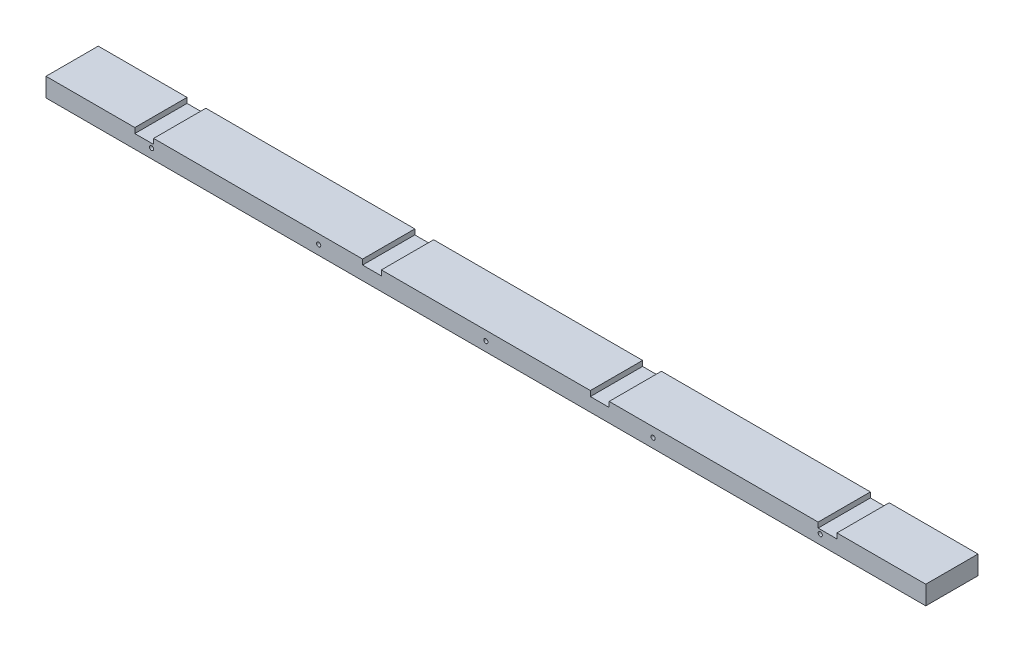
ISO-10303-21;
HEADER;
FILE_DESCRIPTION(('STEP AP214'),'2;1');
FILE_NAME('part.step','',(''),(''),'','','');
FILE_SCHEMA(('AUTOMOTIVE_DESIGN { 1 0 10303 214 1 1 1 1 }'));
ENDSEC;
DATA;
#1=APPLICATION_CONTEXT('core data for automotive mechanical design processes');
#2=APPLICATION_PROTOCOL_DEFINITION('international standard','automotive_design',2000,#1);
#3=PRODUCT_CONTEXT('',#1,'mechanical');
#4=PRODUCT('Part','Part','',(#3));
#5=PRODUCT_RELATED_PRODUCT_CATEGORY('part','',(#4));
#6=PRODUCT_DEFINITION_FORMATION('','',#4);
#7=PRODUCT_DEFINITION_CONTEXT('part definition',#1,'design');
#8=PRODUCT_DEFINITION('design','',#6,#7);
#9=PRODUCT_DEFINITION_SHAPE('','',#8);
#10=(LENGTH_UNIT() NAMED_UNIT(*) SI_UNIT(.MILLI.,.METRE.));
#11=(NAMED_UNIT(*) PLANE_ANGLE_UNIT() SI_UNIT($,.RADIAN.));
#12=(NAMED_UNIT(*) SI_UNIT($,.STERADIAN.) SOLID_ANGLE_UNIT());
#13=UNCERTAINTY_MEASURE_WITH_UNIT(LENGTH_MEASURE(1.E-05),#10,'distance_accuracy_value','');
#14=(GEOMETRIC_REPRESENTATION_CONTEXT(3) GLOBAL_UNCERTAINTY_ASSIGNED_CONTEXT((#13)) GLOBAL_UNIT_ASSIGNED_CONTEXT((#10,
#11,#12)) REPRESENTATION_CONTEXT('',''));
#15=CARTESIAN_POINT('',(0.,0.,0.));
#16=DIRECTION('',(0.,0.,1.));
#17=DIRECTION('',(1.,0.,0.));
#18=AXIS2_PLACEMENT_3D('',#15,#16,#17);
#19=CARTESIAN_POINT('',(0.,18.,0.));
#20=DIRECTION('',(0.,-1.,0.));
#21=DIRECTION('',(0.,0.,-1.));
#22=AXIS2_PLACEMENT_3D('',#19,#20,#21);
#23=PLANE('',#22);
#24=DIRECTION('',(1.,0.,0.));
#25=VECTOR('',#24,1.);
#26=CARTESIAN_POINT('',(-421.,18.,25.));
#27=LINE('',#26,#25);
#28=CARTESIAN_POINT('',(118.,18.,25.));
#29=VERTEX_POINT('',#28);
#30=CARTESIAN_POINT('',(318.,18.,25.));
#31=VERTEX_POINT('',#30);
#32=EDGE_CURVE('E419',#29,#31,#27,.T.);
#33=ORIENTED_EDGE('',*,*,#32,.T.);
#34=DIRECTION('',(0.,0.,-1.));
#35=VECTOR('',#34,1.);
#36=CARTESIAN_POINT('',(318.,18.,0.));
#37=LINE('',#36,#35);
#38=CARTESIAN_POINT('',(318.,18.,-25.));
#39=VERTEX_POINT('',#38);
#40=EDGE_CURVE('E41',#31,#39,#37,.T.);
#41=ORIENTED_EDGE('',*,*,#40,.T.);
#42=DIRECTION('',(-1.,0.,0.));
#43=VECTOR('',#42,1.);
#44=CARTESIAN_POINT('',(-421.,18.,-25.));
#45=LINE('',#44,#43);
#46=CARTESIAN_POINT('',(118.,18.,-25.));
#47=VERTEX_POINT('',#46);
#48=EDGE_CURVE('E364',#39,#47,#45,.T.);
#49=ORIENTED_EDGE('',*,*,#48,.T.);
#50=DIRECTION('',(0.,0.,1.));
#51=VECTOR('',#50,1.);
#52=CARTESIAN_POINT('',(118.,18.,0.));
#53=LINE('',#52,#51);
#54=EDGE_CURVE('E406',#47,#29,#53,.T.);
#55=ORIENTED_EDGE('',*,*,#54,.T.);
#56=EDGE_LOOP('',(#33,#41,#49,#55));
#57=FACE_BOUND('',#56,.T.);
#58=ADVANCED_FACE('F33',(#57),#23,.F.);
#59=CARTESIAN_POINT('',(-100.,18.,25.));
#60=VERTEX_POINT('',#59);
#61=CARTESIAN_POINT('',(100.,18.,25.));
#62=VERTEX_POINT('',#61);
#63=EDGE_CURVE('E461',#60,#62,#27,.T.);
#64=ORIENTED_EDGE('',*,*,#63,.T.);
#65=DIRECTION('',(0.,0.,-1.));
#66=VECTOR('',#65,1.);
#67=CARTESIAN_POINT('',(100.,18.,0.));
#68=LINE('',#67,#66);
#69=CARTESIAN_POINT('',(100.,18.,-25.));
#70=VERTEX_POINT('',#69);
#71=EDGE_CURVE('E408',#62,#70,#68,.T.);
#72=ORIENTED_EDGE('',*,*,#71,.T.);
#73=CARTESIAN_POINT('',(-100.,18.,-25.));
#74=VERTEX_POINT('',#73);
#75=EDGE_CURVE('E425',#70,#74,#45,.T.);
#76=ORIENTED_EDGE('',*,*,#75,.T.);
#77=DIRECTION('',(0.,0.,1.));
#78=VECTOR('',#77,1.);
#79=CARTESIAN_POINT('',(-100.,18.,0.));
#80=LINE('',#79,#78);
#81=EDGE_CURVE('E398',#74,#60,#80,.T.);
#82=ORIENTED_EDGE('',*,*,#81,.T.);
#83=EDGE_LOOP('',(#64,#72,#76,#82));
#84=FACE_BOUND('',#83,.T.);
#85=ADVANCED_FACE('F489',(#84),#23,.F.);
#86=CARTESIAN_POINT('',(-318.,18.,25.));
#87=VERTEX_POINT('',#86);
#88=CARTESIAN_POINT('',(-118.,18.,24.9999999999999));
#89=VERTEX_POINT('',#88);
#90=EDGE_CURVE('E371',#87,#89,#27,.T.);
#91=ORIENTED_EDGE('',*,*,#90,.T.);
#92=DIRECTION('',(0.,0.,-1.));
#93=VECTOR('',#92,1.);
#94=CARTESIAN_POINT('',(-118.,18.,0.));
#95=LINE('',#94,#93);
#96=CARTESIAN_POINT('',(-118.,18.,-25.));
#97=VERTEX_POINT('',#96);
#98=EDGE_CURVE('E401',#89,#97,#95,.T.);
#99=ORIENTED_EDGE('',*,*,#98,.T.);
#100=CARTESIAN_POINT('',(-318.,18.,-25.));
#101=VERTEX_POINT('',#100);
#102=EDGE_CURVE('E426',#97,#101,#45,.T.);
#103=ORIENTED_EDGE('',*,*,#102,.T.);
#104=DIRECTION('',(0.,0.,1.));
#105=VECTOR('',#104,1.);
#106=CARTESIAN_POINT('',(-318.,18.,0.));
#107=LINE('',#106,#105);
#108=EDGE_CURVE('E390',#101,#87,#107,.T.);
#109=ORIENTED_EDGE('',*,*,#108,.T.);
#110=EDGE_LOOP('',(#91,#99,#103,#109));
#111=FACE_BOUND('',#110,.T.);
#112=ADVANCED_FACE('F459',(#111),#23,.F.);
#113=CARTESIAN_POINT('',(-421.,18.,25.));
#114=VERTEX_POINT('',#113);
#115=CARTESIAN_POINT('',(-336.,18.,25.));
#116=VERTEX_POINT('',#115);
#117=EDGE_CURVE('E367',#114,#116,#27,.T.);
#118=ORIENTED_EDGE('',*,*,#117,.T.);
#119=DIRECTION('',(0.,0.,-1.));
#120=VECTOR('',#119,1.);
#121=CARTESIAN_POINT('',(-336.,18.,0.));
#122=LINE('',#121,#120);
#123=CARTESIAN_POINT('',(-336.,18.,-25.));
#124=VERTEX_POINT('',#123);
#125=EDGE_CURVE('E393',#116,#124,#122,.T.);
#126=ORIENTED_EDGE('',*,*,#125,.T.);
#127=CARTESIAN_POINT('',(-421.,18.,-25.));
#128=VERTEX_POINT('',#127);
#129=EDGE_CURVE('E358',#124,#128,#45,.T.);
#130=ORIENTED_EDGE('',*,*,#129,.T.);
#131=DIRECTION('',(0.,0.,1.));
#132=VECTOR('',#131,1.);
#133=CARTESIAN_POINT('',(-421.,18.,25.));
#134=LINE('',#133,#132);
#135=EDGE_CURVE('E363',#128,#114,#134,.T.);
#136=ORIENTED_EDGE('',*,*,#135,.T.);
#137=EDGE_LOOP('',(#118,#126,#130,#136));
#138=FACE_BOUND('',#137,.T.);
#139=ADVANCED_FACE('F436',(#138),#23,.F.);
#140=CARTESIAN_POINT('',(421.,18.,25.));
#141=DIRECTION('',(-1.,0.,0.));
#142=DIRECTION('',(0.,0.,1.));
#143=AXIS2_PLACEMENT_3D('',#140,#141,#142);
#144=PLANE('',#143);
#145=DIRECTION('',(0.,0.,-1.));
#146=VECTOR('',#145,1.);
#147=CARTESIAN_POINT('',(421.,0.,25.));
#148=LINE('',#147,#146);
#149=CARTESIAN_POINT('',(421.,0.,25.));
#150=VERTEX_POINT('',#149);
#151=CARTESIAN_POINT('',(421.,0.,-25.));
#152=VERTEX_POINT('',#151);
#153=EDGE_CURVE('E354',#150,#152,#148,.T.);
#154=ORIENTED_EDGE('',*,*,#153,.T.);
#155=DIRECTION('',(0.,-1.,0.));
#156=VECTOR('',#155,1.);
#157=CARTESIAN_POINT('',(421.,18.,-25.));
#158=LINE('',#157,#156);
#159=CARTESIAN_POINT('',(421.,18.,-25.));
#160=VERTEX_POINT('',#159);
#161=EDGE_CURVE('E387',#160,#152,#158,.T.);
#162=ORIENTED_EDGE('',*,*,#161,.F.);
#163=DIRECTION('',(0.,0.,-1.));
#164=VECTOR('',#163,1.);
#165=CARTESIAN_POINT('',(421.,18.,25.));
#166=LINE('',#165,#164);
#167=CARTESIAN_POINT('',(421.,18.,25.));
#168=VERTEX_POINT('',#167);
#169=EDGE_CURVE('E355',#168,#160,#166,.T.);
#170=ORIENTED_EDGE('',*,*,#169,.F.);
#171=DIRECTION('',(0.,-1.,0.));
#172=VECTOR('',#171,1.);
#173=CARTESIAN_POINT('',(421.,18.,25.));
#174=LINE('',#173,#172);
#175=EDGE_CURVE('E370',#168,#150,#174,.T.);
#176=ORIENTED_EDGE('',*,*,#175,.T.);
#177=EDGE_LOOP('',(#154,#162,#170,#176));
#178=FACE_BOUND('',#177,.T.);
#179=ADVANCED_FACE('F35',(#178),#144,.F.);
#180=CARTESIAN_POINT('',(-421.,18.,-25.));
#181=DIRECTION('',(0.,0.,1.));
#182=DIRECTION('',(1.,0.,0.));
#183=AXIS2_PLACEMENT_3D('',#180,#181,#182);
#184=PLANE('',#183);
#185=CARTESIAN_POINT('',(362.5,9.00000000000005,-25.));
#186=DIRECTION('',(0.,0.,-1.));
#187=DIRECTION('',(-1.,0.,0.));
#188=AXIS2_PLACEMENT_3D('',#185,#186,#187);
#189=CIRCLE('',#188,2.);
#190=CARTESIAN_POINT('',(360.5,9.00000000000005,-25.));
#191=VERTEX_POINT('',#190);
#192=EDGE_CURVE('E214',#191,#191,#189,.T.);
#193=ORIENTED_EDGE('',*,*,#192,.F.);
#194=EDGE_LOOP('',(#193));
#195=FACE_BOUND('',#194,.T.);
#196=CARTESIAN_POINT('',(217.5,9.00000000000004,-25.));
#197=DIRECTION('',(0.,0.,-1.));
#198=DIRECTION('',(-1.,0.,0.));
#199=AXIS2_PLACEMENT_3D('',#196,#197,#198);
#200=CIRCLE('',#199,2.);
#201=CARTESIAN_POINT('',(215.5,9.00000000000004,-25.));
#202=VERTEX_POINT('',#201);
#203=EDGE_CURVE('E213',#202,#202,#200,.T.);
#204=ORIENTED_EDGE('',*,*,#203,.F.);
#205=EDGE_LOOP('',(#204));
#206=FACE_BOUND('',#205,.T.);
#207=CARTESIAN_POINT('',(72.5,9.00000000000005,-25.));
#208=DIRECTION('',(0.,0.,-1.));
#209=DIRECTION('',(-1.,0.,0.));
#210=AXIS2_PLACEMENT_3D('',#207,#208,#209);
#211=CIRCLE('',#210,1.99999999999999);
#212=CARTESIAN_POINT('',(70.5,9.00000000000005,-25.));
#213=VERTEX_POINT('',#212);
#214=EDGE_CURVE('E224',#213,#213,#211,.T.);
#215=ORIENTED_EDGE('',*,*,#214,.F.);
#216=EDGE_LOOP('',(#215));
#217=FACE_BOUND('',#216,.T.);
#218=CARTESIAN_POINT('',(-72.5,9.00000000000004,-25.));
#219=DIRECTION('',(0.,0.,-1.));
#220=DIRECTION('',(-1.,0.,0.));
#221=AXIS2_PLACEMENT_3D('',#218,#219,#220);
#222=CIRCLE('',#221,1.99999999999999);
#223=CARTESIAN_POINT('',(-74.5,9.00000000000004,-25.));
#224=VERTEX_POINT('',#223);
#225=EDGE_CURVE('E230',#224,#224,#222,.T.);
#226=ORIENTED_EDGE('',*,*,#225,.F.);
#227=EDGE_LOOP('',(#226));
#228=FACE_BOUND('',#227,.T.);
#229=CARTESIAN_POINT('',(-217.5,9.00000000000005,-25.));
#230=DIRECTION('',(0.,0.,-1.));
#231=DIRECTION('',(-1.,0.,0.));
#232=AXIS2_PLACEMENT_3D('',#229,#230,#231);
#233=CIRCLE('',#232,2.);
#234=CARTESIAN_POINT('',(-219.5,9.00000000000005,-25.));
#235=VERTEX_POINT('',#234);
#236=EDGE_CURVE('E236',#235,#235,#233,.T.);
#237=ORIENTED_EDGE('',*,*,#236,.F.);
#238=EDGE_LOOP('',(#237));
#239=FACE_BOUND('',#238,.T.);
#240=CARTESIAN_POINT('',(-362.5,9.00000000000005,-25.));
#241=DIRECTION('',(0.,0.,-1.));
#242=DIRECTION('',(-1.,0.,0.));
#243=AXIS2_PLACEMENT_3D('',#240,#241,#242);
#244=CIRCLE('',#243,2.);
#245=CARTESIAN_POINT('',(-364.5,9.00000000000005,-25.));
#246=VERTEX_POINT('',#245);
#247=EDGE_CURVE('E242',#246,#246,#244,.T.);
#248=ORIENTED_EDGE('',*,*,#247,.F.);
#249=EDGE_LOOP('',(#248));
#250=FACE_BOUND('',#249,.T.);
#251=ORIENTED_EDGE('',*,*,#48,.F.);
#252=DIRECTION('',(0.,-1.,0.));
#253=VECTOR('',#252,1.);
#254=CARTESIAN_POINT('',(318.,18.,-25.));
#255=LINE('',#254,#253);
#256=CARTESIAN_POINT('',(318.,13.,-25.));
#257=VERTEX_POINT('',#256);
#258=EDGE_CURVE('E291',#39,#257,#255,.T.);
#259=ORIENTED_EDGE('',*,*,#258,.T.);
#260=DIRECTION('',(-1.,0.,0.));
#261=VECTOR('',#260,1.);
#262=CARTESIAN_POINT('',(-421.,13.,-25.));
#263=LINE('',#262,#261);
#264=CARTESIAN_POINT('',(336.,13.,-25.));
#265=VERTEX_POINT('',#264);
#266=EDGE_CURVE('E294',#265,#257,#263,.T.);
#267=ORIENTED_EDGE('',*,*,#266,.F.);
#268=DIRECTION('',(0.,1.,0.));
#269=VECTOR('',#268,1.);
#270=CARTESIAN_POINT('',(336.,18.,-25.));
#271=LINE('',#270,#269);
#272=CARTESIAN_POINT('',(336.,18.,-25.));
#273=VERTEX_POINT('',#272);
#274=EDGE_CURVE('E285',#265,#273,#271,.T.);
#275=ORIENTED_EDGE('',*,*,#274,.T.);
#276=EDGE_CURVE('E360',#160,#273,#45,.T.);
#277=ORIENTED_EDGE('',*,*,#276,.F.);
#278=ORIENTED_EDGE('',*,*,#161,.T.);
#279=DIRECTION('',(-1.,0.,0.));
#280=VECTOR('',#279,1.);
#281=CARTESIAN_POINT('',(-421.,0.,-25.));
#282=LINE('',#281,#280);
#283=CARTESIAN_POINT('',(-421.,0.,-25.));
#284=VERTEX_POINT('',#283);
#285=EDGE_CURVE('E374',#152,#284,#282,.T.);
#286=ORIENTED_EDGE('',*,*,#285,.T.);
#287=DIRECTION('',(0.,-1.,0.));
#288=VECTOR('',#287,1.);
#289=CARTESIAN_POINT('',(-421.,18.,-25.));
#290=LINE('',#289,#288);
#291=EDGE_CURVE('E384',#128,#284,#290,.T.);
#292=ORIENTED_EDGE('',*,*,#291,.F.);
#293=ORIENTED_EDGE('',*,*,#129,.F.);
#294=DIRECTION('',(0.,-1.,0.));
#295=VECTOR('',#294,1.);
#296=CARTESIAN_POINT('',(-336.,18.,-25.));
#297=LINE('',#296,#295);
#298=CARTESIAN_POINT('',(-336.,13.,-25.));
#299=VERTEX_POINT('',#298);
#300=EDGE_CURVE('E349',#124,#299,#297,.T.);
#301=ORIENTED_EDGE('',*,*,#300,.T.);
#302=DIRECTION('',(-1.,0.,0.));
#303=VECTOR('',#302,1.);
#304=CARTESIAN_POINT('',(-421.,13.,-25.));
#305=LINE('',#304,#303);
#306=CARTESIAN_POINT('',(-318.,13.,-25.));
#307=VERTEX_POINT('',#306);
#308=EDGE_CURVE('E352',#307,#299,#305,.T.);
#309=ORIENTED_EDGE('',*,*,#308,.F.);
#310=DIRECTION('',(0.,1.,0.));
#311=VECTOR('',#310,1.);
#312=CARTESIAN_POINT('',(-318.,18.,-25.));
#313=LINE('',#312,#311);
#314=EDGE_CURVE('E343',#307,#101,#313,.T.);
#315=ORIENTED_EDGE('',*,*,#314,.T.);
#316=ORIENTED_EDGE('',*,*,#102,.F.);
#317=DIRECTION('',(0.,-1.,0.));
#318=VECTOR('',#317,1.);
#319=CARTESIAN_POINT('',(-118.,18.,-25.));
#320=LINE('',#319,#318);
#321=CARTESIAN_POINT('',(-118.,13.,-25.));
#322=VERTEX_POINT('',#321);
#323=EDGE_CURVE('E329',#97,#322,#320,.T.);
#324=ORIENTED_EDGE('',*,*,#323,.T.);
#325=DIRECTION('',(-1.,0.,0.));
#326=VECTOR('',#325,1.);
#327=CARTESIAN_POINT('',(-421.,13.,-25.));
#328=LINE('',#327,#326);
#329=CARTESIAN_POINT('',(-100.,13.,-25.));
#330=VERTEX_POINT('',#329);
#331=EDGE_CURVE('E332',#330,#322,#328,.T.);
#332=ORIENTED_EDGE('',*,*,#331,.F.);
#333=DIRECTION('',(0.,1.,0.));
#334=VECTOR('',#333,1.);
#335=CARTESIAN_POINT('',(-100.,18.,-25.));
#336=LINE('',#335,#334);
#337=EDGE_CURVE('E323',#330,#74,#336,.T.);
#338=ORIENTED_EDGE('',*,*,#337,.T.);
#339=ORIENTED_EDGE('',*,*,#75,.F.);
#340=DIRECTION('',(0.,-1.,0.));
#341=VECTOR('',#340,1.);
#342=CARTESIAN_POINT('',(100.,18.,-25.));
#343=LINE('',#342,#341);
#344=CARTESIAN_POINT('',(100.,13.,-25.));
#345=VERTEX_POINT('',#344);
#346=EDGE_CURVE('E309',#70,#345,#343,.T.);
#347=ORIENTED_EDGE('',*,*,#346,.T.);
#348=DIRECTION('',(-1.,0.,0.));
#349=VECTOR('',#348,1.);
#350=CARTESIAN_POINT('',(-421.,13.,-25.));
#351=LINE('',#350,#349);
#352=CARTESIAN_POINT('',(118.,13.,-25.));
#353=VERTEX_POINT('',#352);
#354=EDGE_CURVE('E312',#353,#345,#351,.T.);
#355=ORIENTED_EDGE('',*,*,#354,.F.);
#356=DIRECTION('',(0.,1.,0.));
#357=VECTOR('',#356,1.);
#358=CARTESIAN_POINT('',(118.,18.,-25.));
#359=LINE('',#358,#357);
#360=EDGE_CURVE('E303',#353,#47,#359,.T.);
#361=ORIENTED_EDGE('',*,*,#360,.T.);
#362=EDGE_LOOP('',(#251,#259,#267,#275,#277,#278,#286,#292,#293,#301,#309,#315,#316,#324,#332,
#338,#339,#347,#355,#361));
#363=FACE_BOUND('',#362,.T.);
#364=ADVANCED_FACE('F422',(#195,#206,#217,#228,#239,#250,#363),#184,.F.);
#365=CARTESIAN_POINT('',(-421.,18.,25.));
#366=DIRECTION('',(1.,0.,0.));
#367=DIRECTION('',(0.,0.,-1.));
#368=AXIS2_PLACEMENT_3D('',#365,#366,#367);
#369=PLANE('',#368);
#370=DIRECTION('',(0.,0.,1.));
#371=VECTOR('',#370,1.);
#372=CARTESIAN_POINT('',(-421.,0.,25.));
#373=LINE('',#372,#371);
#374=CARTESIAN_POINT('',(-421.,0.,25.));
#375=VERTEX_POINT('',#374);
#376=EDGE_CURVE('E376',#284,#375,#373,.T.);
#377=ORIENTED_EDGE('',*,*,#376,.T.);
#378=DIRECTION('',(0.,-1.,0.));
#379=VECTOR('',#378,1.);
#380=CARTESIAN_POINT('',(-421.,18.,25.));
#381=LINE('',#380,#379);
#382=EDGE_CURVE('E381',#114,#375,#381,.T.);
#383=ORIENTED_EDGE('',*,*,#382,.F.);
#384=ORIENTED_EDGE('',*,*,#135,.F.);
#385=ORIENTED_EDGE('',*,*,#291,.T.);
#386=EDGE_LOOP('',(#377,#383,#384,#385));
#387=FACE_BOUND('',#386,.T.);
#388=ADVANCED_FACE('F441',(#387),#369,.F.);
#389=CARTESIAN_POINT('',(-421.,18.,25.));
#390=DIRECTION('',(0.,0.,-1.));
#391=DIRECTION('',(-1.,0.,0.));
#392=AXIS2_PLACEMENT_3D('',#389,#390,#391);
#393=PLANE('',#392);
#394=CARTESIAN_POINT('',(-320.,9.00000000000009,25.));
#395=DIRECTION('',(0.,0.,1.));
#396=DIRECTION('',(1.,0.,0.));
#397=AXIS2_PLACEMENT_3D('',#394,#395,#396);
#398=CIRCLE('',#397,2.);
#399=CARTESIAN_POINT('',(-318.,9.00000000000009,25.));
#400=VERTEX_POINT('',#399);
#401=EDGE_CURVE('E248',#400,#400,#398,.T.);
#402=ORIENTED_EDGE('',*,*,#401,.F.);
#403=EDGE_LOOP('',(#402));
#404=FACE_BOUND('',#403,.T.);
#405=CARTESIAN_POINT('',(-160.,9.00000000000006,25.));
#406=DIRECTION('',(0.,0.,1.));
#407=DIRECTION('',(1.,0.,0.));
#408=AXIS2_PLACEMENT_3D('',#405,#406,#407);
#409=CIRCLE('',#408,2.);
#410=CARTESIAN_POINT('',(-158.,9.00000000000006,25.));
#411=VERTEX_POINT('',#410);
#412=EDGE_CURVE('E254',#411,#411,#409,.T.);
#413=ORIENTED_EDGE('',*,*,#412,.F.);
#414=EDGE_LOOP('',(#413));
#415=FACE_BOUND('',#414,.T.);
#416=CARTESIAN_POINT('',(1.74082970261225E-13,9.00000000000005,25.));
#417=DIRECTION('',(0.,0.,1.));
#418=DIRECTION('',(1.,0.,0.));
#419=AXIS2_PLACEMENT_3D('',#416,#417,#418);
#420=CIRCLE('',#419,1.99999999999999);
#421=CARTESIAN_POINT('',(2.00000000000016,9.00000000000005,25.));
#422=VERTEX_POINT('',#421);
#423=EDGE_CURVE('E260',#422,#422,#420,.T.);
#424=ORIENTED_EDGE('',*,*,#423,.F.);
#425=EDGE_LOOP('',(#424));
#426=FACE_BOUND('',#425,.T.);
#427=CARTESIAN_POINT('',(160.,9.00000000000004,25.));
#428=DIRECTION('',(0.,0.,1.));
#429=DIRECTION('',(1.,0.,0.));
#430=AXIS2_PLACEMENT_3D('',#427,#428,#429);
#431=CIRCLE('',#430,2.);
#432=CARTESIAN_POINT('',(162.,9.00000000000004,25.));
#433=VERTEX_POINT('',#432);
#434=EDGE_CURVE('E266',#433,#433,#431,.T.);
#435=ORIENTED_EDGE('',*,*,#434,.F.);
#436=EDGE_LOOP('',(#435));
#437=FACE_BOUND('',#436,.T.);
#438=CARTESIAN_POINT('',(320.,9.00000000000001,25.));
#439=DIRECTION('',(0.,0.,1.));
#440=DIRECTION('',(1.,0.,0.));
#441=AXIS2_PLACEMENT_3D('',#438,#439,#440);
#442=CIRCLE('',#441,2.);
#443=CARTESIAN_POINT('',(322.,9.00000000000001,25.));
#444=VERTEX_POINT('',#443);
#445=EDGE_CURVE('E272',#444,#444,#442,.T.);
#446=ORIENTED_EDGE('',*,*,#445,.F.);
#447=EDGE_LOOP('',(#446));
#448=FACE_BOUND('',#447,.T.);
#449=DIRECTION('',(1.,0.,0.));
#450=VECTOR('',#449,1.);
#451=CARTESIAN_POINT('',(-421.,13.,25.));
#452=LINE('',#451,#450);
#453=CARTESIAN_POINT('',(318.,13.,25.));
#454=VERTEX_POINT('',#453);
#455=CARTESIAN_POINT('',(336.,13.,24.9999999999999));
#456=VERTEX_POINT('',#455);
#457=EDGE_CURVE('E11',#454,#456,#452,.T.);
#458=ORIENTED_EDGE('',*,*,#457,.F.);
#459=DIRECTION('',(0.,1.,0.));
#460=VECTOR('',#459,1.);
#461=CARTESIAN_POINT('',(318.,18.,25.));
#462=LINE('',#461,#460);
#463=EDGE_CURVE('E288',#454,#31,#462,.T.);
#464=ORIENTED_EDGE('',*,*,#463,.T.);
#465=ORIENTED_EDGE('',*,*,#32,.F.);
#466=DIRECTION('',(0.,-1.,0.));
#467=VECTOR('',#466,1.);
#468=CARTESIAN_POINT('',(118.,18.,25.));
#469=LINE('',#468,#467);
#470=CARTESIAN_POINT('',(118.,13.,24.9999999999999));
#471=VERTEX_POINT('',#470);
#472=EDGE_CURVE('E56',#29,#471,#469,.T.);
#473=ORIENTED_EDGE('',*,*,#472,.T.);
#474=DIRECTION('',(1.,0.,0.));
#475=VECTOR('',#474,1.);
#476=CARTESIAN_POINT('',(-421.,13.,25.));
#477=LINE('',#476,#475);
#478=CARTESIAN_POINT('',(100.,13.,25.));
#479=VERTEX_POINT('',#478);
#480=EDGE_CURVE('E411',#479,#471,#477,.T.);
#481=ORIENTED_EDGE('',*,*,#480,.F.);
#482=DIRECTION('',(0.,1.,0.));
#483=VECTOR('',#482,1.);
#484=CARTESIAN_POINT('',(100.,18.,25.));
#485=LINE('',#484,#483);
#486=EDGE_CURVE('E306',#479,#62,#485,.T.);
#487=ORIENTED_EDGE('',*,*,#486,.T.);
#488=ORIENTED_EDGE('',*,*,#63,.F.);
#489=DIRECTION('',(0.,-1.,0.));
#490=VECTOR('',#489,1.);
#491=CARTESIAN_POINT('',(-100.,18.,25.));
#492=LINE('',#491,#490);
#493=CARTESIAN_POINT('',(-100.,13.,24.9999999999999));
#494=VERTEX_POINT('',#493);
#495=EDGE_CURVE('E320',#60,#494,#492,.T.);
#496=ORIENTED_EDGE('',*,*,#495,.T.);
#497=DIRECTION('',(1.,0.,0.));
#498=VECTOR('',#497,1.);
#499=CARTESIAN_POINT('',(-421.,13.,25.));
#500=LINE('',#499,#498);
#501=CARTESIAN_POINT('',(-118.,13.,24.9999999999999));
#502=VERTEX_POINT('',#501);
#503=EDGE_CURVE('E404',#502,#494,#500,.T.);
#504=ORIENTED_EDGE('',*,*,#503,.F.);
#505=DIRECTION('',(0.,1.,0.));
#506=VECTOR('',#505,1.);
#507=CARTESIAN_POINT('',(-118.,18.,25.));
#508=LINE('',#507,#506);
#509=EDGE_CURVE('E326',#502,#89,#508,.T.);
#510=ORIENTED_EDGE('',*,*,#509,.T.);
#511=ORIENTED_EDGE('',*,*,#90,.F.);
#512=DIRECTION('',(0.,-1.,0.));
#513=VECTOR('',#512,1.);
#514=CARTESIAN_POINT('',(-318.,18.,25.));
#515=LINE('',#514,#513);
#516=CARTESIAN_POINT('',(-318.,13.,24.9999999999999));
#517=VERTEX_POINT('',#516);
#518=EDGE_CURVE('E340',#87,#517,#515,.T.);
#519=ORIENTED_EDGE('',*,*,#518,.T.);
#520=DIRECTION('',(1.,0.,0.));
#521=VECTOR('',#520,1.);
#522=CARTESIAN_POINT('',(-421.,13.,25.));
#523=LINE('',#522,#521);
#524=CARTESIAN_POINT('',(-336.,13.,25.));
#525=VERTEX_POINT('',#524);
#526=EDGE_CURVE('E396',#525,#517,#523,.T.);
#527=ORIENTED_EDGE('',*,*,#526,.F.);
#528=DIRECTION('',(0.,1.,0.));
#529=VECTOR('',#528,1.);
#530=CARTESIAN_POINT('',(-336.,18.,25.));
#531=LINE('',#530,#529);
#532=EDGE_CURVE('E346',#525,#116,#531,.T.);
#533=ORIENTED_EDGE('',*,*,#532,.T.);
#534=ORIENTED_EDGE('',*,*,#117,.F.);
#535=ORIENTED_EDGE('',*,*,#382,.T.);
#536=DIRECTION('',(1.,0.,0.));
#537=VECTOR('',#536,1.);
#538=CARTESIAN_POINT('',(-421.,0.,25.));
#539=LINE('',#538,#537);
#540=EDGE_CURVE('E359',#375,#150,#539,.T.);
#541=ORIENTED_EDGE('',*,*,#540,.T.);
#542=ORIENTED_EDGE('',*,*,#175,.F.);
#543=CARTESIAN_POINT('',(336.,18.,25.));
#544=VERTEX_POINT('',#543);
#545=EDGE_CURVE('E366',#544,#168,#27,.T.);
#546=ORIENTED_EDGE('',*,*,#545,.F.);
#547=DIRECTION('',(0.,-1.,0.));
#548=VECTOR('',#547,1.);
#549=CARTESIAN_POINT('',(336.,18.,25.));
#550=LINE('',#549,#548);
#551=EDGE_CURVE('E48',#544,#456,#550,.T.);
#552=ORIENTED_EDGE('',*,*,#551,.T.);
#553=EDGE_LOOP('',(#458,#464,#465,#473,#481,#487,#488,#496,#504,#510,#511,#519,#527,#533,#534,
#535,#541,#542,#546,#552));
#554=FACE_BOUND('',#553,.T.);
#555=ADVANCED_FACE('F446',(#404,#415,#426,#437,#448,#554),#393,.F.);
#556=ORIENTED_EDGE('',*,*,#276,.T.);
#557=DIRECTION('',(0.,0.,1.));
#558=VECTOR('',#557,1.);
#559=CARTESIAN_POINT('',(336.,18.,0.));
#560=LINE('',#559,#558);
#561=EDGE_CURVE('E413',#273,#544,#560,.T.);
#562=ORIENTED_EDGE('',*,*,#561,.T.);
#563=ORIENTED_EDGE('',*,*,#545,.T.);
#564=ORIENTED_EDGE('',*,*,#169,.T.);
#565=EDGE_LOOP('',(#556,#562,#563,#564));
#566=FACE_BOUND('',#565,.T.);
#567=ADVANCED_FACE('F467',(#566),#23,.F.);
#568=CARTESIAN_POINT('',(0.,0.,0.));
#569=DIRECTION('',(0.,-1.,0.));
#570=DIRECTION('',(0.,0.,-1.));
#571=AXIS2_PLACEMENT_3D('',#568,#569,#570);
#572=PLANE('',#571);
#573=ORIENTED_EDGE('',*,*,#153,.F.);
#574=ORIENTED_EDGE('',*,*,#540,.F.);
#575=ORIENTED_EDGE('',*,*,#376,.F.);
#576=ORIENTED_EDGE('',*,*,#285,.F.);
#577=EDGE_LOOP('',(#573,#574,#575,#576));
#578=FACE_BOUND('',#577,.T.);
#579=ADVANCED_FACE('F497',(#578),#572,.T.);
#580=CARTESIAN_POINT('',(0.,13.,0.));
#581=DIRECTION('',(0.,1.,0.));
#582=DIRECTION('',(0.,0.,1.));
#583=AXIS2_PLACEMENT_3D('',#580,#581,#582);
#584=PLANE('',#583);
#585=ORIENTED_EDGE('',*,*,#308,.T.);
#586=DIRECTION('',(0.,0.,1.));
#587=VECTOR('',#586,1.);
#588=CARTESIAN_POINT('',(-336.,13.,-129.540103588909));
#589=LINE('',#588,#587);
#590=EDGE_CURVE('E334',#299,#525,#589,.T.);
#591=ORIENTED_EDGE('',*,*,#590,.T.);
#592=ORIENTED_EDGE('',*,*,#526,.T.);
#593=DIRECTION('',(0.,0.,-1.));
#594=VECTOR('',#593,1.);
#595=CARTESIAN_POINT('',(-318.,13.,-129.540103588909));
#596=LINE('',#595,#594);
#597=EDGE_CURVE('E337',#517,#307,#596,.T.);
#598=ORIENTED_EDGE('',*,*,#597,.T.);
#599=EDGE_LOOP('',(#585,#591,#592,#598));
#600=FACE_BOUND('',#599,.T.);
#601=ADVANCED_FACE('F452',(#600),#584,.T.);
#602=CARTESIAN_POINT('',(-336.,13.,-129.540103588909));
#603=DIRECTION('',(-1.,0.,0.));
#604=DIRECTION('',(0.,0.,1.));
#605=AXIS2_PLACEMENT_3D('',#602,#603,#604);
#606=PLANE('',#605);
#607=ORIENTED_EDGE('',*,*,#125,.F.);
#608=ORIENTED_EDGE('',*,*,#532,.F.);
#609=ORIENTED_EDGE('',*,*,#590,.F.);
#610=ORIENTED_EDGE('',*,*,#300,.F.);
#611=EDGE_LOOP('',(#607,#608,#609,#610));
#612=FACE_BOUND('',#611,.T.);
#613=ADVANCED_FACE('F450',(#612),#606,.F.);
#614=CARTESIAN_POINT('',(-318.,13.,-129.540103588909));
#615=DIRECTION('',(1.,0.,0.));
#616=DIRECTION('',(0.,0.,-1.));
#617=AXIS2_PLACEMENT_3D('',#614,#615,#616);
#618=PLANE('',#617);
#619=ORIENTED_EDGE('',*,*,#597,.F.);
#620=ORIENTED_EDGE('',*,*,#518,.F.);
#621=ORIENTED_EDGE('',*,*,#108,.F.);
#622=ORIENTED_EDGE('',*,*,#314,.F.);
#623=EDGE_LOOP('',(#619,#620,#621,#622));
#624=FACE_BOUND('',#623,.T.);
#625=ADVANCED_FACE('F456',(#624),#618,.F.);
#626=CARTESIAN_POINT('',(0.,13.,0.));
#627=DIRECTION('',(0.,1.,0.));
#628=DIRECTION('',(0.,0.,1.));
#629=AXIS2_PLACEMENT_3D('',#626,#627,#628);
#630=PLANE('',#629);
#631=ORIENTED_EDGE('',*,*,#331,.T.);
#632=DIRECTION('',(0.,0.,1.));
#633=VECTOR('',#632,1.);
#634=CARTESIAN_POINT('',(-118.,13.,-129.540103588909));
#635=LINE('',#634,#633);
#636=EDGE_CURVE('E314',#322,#502,#635,.T.);
#637=ORIENTED_EDGE('',*,*,#636,.T.);
#638=ORIENTED_EDGE('',*,*,#503,.T.);
#639=DIRECTION('',(0.,0.,-1.));
#640=VECTOR('',#639,1.);
#641=CARTESIAN_POINT('',(-100.,13.,-129.540103588909));
#642=LINE('',#641,#640);
#643=EDGE_CURVE('E317',#494,#330,#642,.T.);
#644=ORIENTED_EDGE('',*,*,#643,.T.);
#645=EDGE_LOOP('',(#631,#637,#638,#644));
#646=FACE_BOUND('',#645,.T.);
#647=ADVANCED_FACE('F831',(#646),#630,.T.);
#648=CARTESIAN_POINT('',(-118.,13.,-129.540103588909));
#649=DIRECTION('',(-1.,0.,0.));
#650=DIRECTION('',(0.,0.,1.));
#651=AXIS2_PLACEMENT_3D('',#648,#649,#650);
#652=PLANE('',#651);
#653=ORIENTED_EDGE('',*,*,#98,.F.);
#654=ORIENTED_EDGE('',*,*,#509,.F.);
#655=ORIENTED_EDGE('',*,*,#636,.F.);
#656=ORIENTED_EDGE('',*,*,#323,.F.);
#657=EDGE_LOOP('',(#653,#654,#655,#656));
#658=FACE_BOUND('',#657,.T.);
#659=ADVANCED_FACE('F822',(#658),#652,.F.);
#660=CARTESIAN_POINT('',(-100.,13.,-129.540103588909));
#661=DIRECTION('',(1.,0.,0.));
#662=DIRECTION('',(0.,0.,-1.));
#663=AXIS2_PLACEMENT_3D('',#660,#661,#662);
#664=PLANE('',#663);
#665=ORIENTED_EDGE('',*,*,#643,.F.);
#666=ORIENTED_EDGE('',*,*,#495,.F.);
#667=ORIENTED_EDGE('',*,*,#81,.F.);
#668=ORIENTED_EDGE('',*,*,#337,.F.);
#669=EDGE_LOOP('',(#665,#666,#667,#668));
#670=FACE_BOUND('',#669,.T.);
#671=ADVANCED_FACE('F814',(#670),#664,.F.);
#672=CARTESIAN_POINT('',(0.,13.,0.));
#673=DIRECTION('',(0.,1.,0.));
#674=DIRECTION('',(0.,0.,1.));
#675=AXIS2_PLACEMENT_3D('',#672,#673,#674);
#676=PLANE('',#675);
#677=ORIENTED_EDGE('',*,*,#354,.T.);
#678=DIRECTION('',(0.,0.,1.));
#679=VECTOR('',#678,1.);
#680=CARTESIAN_POINT('',(100.,13.,-129.540103588909));
#681=LINE('',#680,#679);
#682=EDGE_CURVE('E296',#345,#479,#681,.T.);
#683=ORIENTED_EDGE('',*,*,#682,.T.);
#684=ORIENTED_EDGE('',*,*,#480,.T.);
#685=DIRECTION('',(0.,0.,-1.));
#686=VECTOR('',#685,1.);
#687=CARTESIAN_POINT('',(118.,13.,-129.540103588909));
#688=LINE('',#687,#686);
#689=EDGE_CURVE('E299',#471,#353,#688,.T.);
#690=ORIENTED_EDGE('',*,*,#689,.T.);
#691=EDGE_LOOP('',(#677,#683,#684,#690));
#692=FACE_BOUND('',#691,.T.);
#693=ADVANCED_FACE('F805',(#692),#676,.T.);
#694=CARTESIAN_POINT('',(100.,13.,-129.540103588909));
#695=DIRECTION('',(-1.,0.,0.));
#696=DIRECTION('',(0.,0.,1.));
#697=AXIS2_PLACEMENT_3D('',#694,#695,#696);
#698=PLANE('',#697);
#699=ORIENTED_EDGE('',*,*,#71,.F.);
#700=ORIENTED_EDGE('',*,*,#486,.F.);
#701=ORIENTED_EDGE('',*,*,#682,.F.);
#702=ORIENTED_EDGE('',*,*,#346,.F.);
#703=EDGE_LOOP('',(#699,#700,#701,#702));
#704=FACE_BOUND('',#703,.T.);
#705=ADVANCED_FACE('F797',(#704),#698,.F.);
#706=CARTESIAN_POINT('',(118.,13.,-129.540103588909));
#707=DIRECTION('',(1.,0.,0.));
#708=DIRECTION('',(0.,0.,-1.));
#709=AXIS2_PLACEMENT_3D('',#706,#707,#708);
#710=PLANE('',#709);
#711=ORIENTED_EDGE('',*,*,#689,.F.);
#712=ORIENTED_EDGE('',*,*,#472,.F.);
#713=ORIENTED_EDGE('',*,*,#54,.F.);
#714=ORIENTED_EDGE('',*,*,#360,.F.);
#715=EDGE_LOOP('',(#711,#712,#713,#714));
#716=FACE_BOUND('',#715,.T.);
#717=ADVANCED_FACE('F485',(#716),#710,.F.);
#718=CARTESIAN_POINT('',(0.,13.,0.));
#719=DIRECTION('',(0.,1.,0.));
#720=DIRECTION('',(0.,0.,1.));
#721=AXIS2_PLACEMENT_3D('',#718,#719,#720);
#722=PLANE('',#721);
#723=ORIENTED_EDGE('',*,*,#266,.T.);
#724=DIRECTION('',(0.,0.,1.));
#725=VECTOR('',#724,1.);
#726=CARTESIAN_POINT('',(318.,13.,-129.540103588909));
#727=LINE('',#726,#725);
#728=EDGE_CURVE('E278',#257,#454,#727,.T.);
#729=ORIENTED_EDGE('',*,*,#728,.T.);
#730=ORIENTED_EDGE('',*,*,#457,.T.);
#731=DIRECTION('',(0.,0.,-1.));
#732=VECTOR('',#731,1.);
#733=CARTESIAN_POINT('',(336.,13.,-129.540103588909));
#734=LINE('',#733,#732);
#735=EDGE_CURVE('E281',#456,#265,#734,.T.);
#736=ORIENTED_EDGE('',*,*,#735,.T.);
#737=EDGE_LOOP('',(#723,#729,#730,#736));
#738=FACE_BOUND('',#737,.T.);
#739=ADVANCED_FACE('F474',(#738),#722,.T.);
#740=CARTESIAN_POINT('',(318.,13.,-129.540103588909));
#741=DIRECTION('',(-1.,0.,0.));
#742=DIRECTION('',(0.,0.,1.));
#743=AXIS2_PLACEMENT_3D('',#740,#741,#742);
#744=PLANE('',#743);
#745=ORIENTED_EDGE('',*,*,#40,.F.);
#746=ORIENTED_EDGE('',*,*,#463,.F.);
#747=ORIENTED_EDGE('',*,*,#728,.F.);
#748=ORIENTED_EDGE('',*,*,#258,.F.);
#749=EDGE_LOOP('',(#745,#746,#747,#748));
#750=FACE_BOUND('',#749,.T.);
#751=ADVANCED_FACE('F476',(#750),#744,.F.);
#752=CARTESIAN_POINT('',(336.,13.,-129.540103588909));
#753=DIRECTION('',(1.,0.,0.));
#754=DIRECTION('',(0.,0.,-1.));
#755=AXIS2_PLACEMENT_3D('',#752,#753,#754);
#756=PLANE('',#755);
#757=ORIENTED_EDGE('',*,*,#735,.F.);
#758=ORIENTED_EDGE('',*,*,#551,.F.);
#759=ORIENTED_EDGE('',*,*,#561,.F.);
#760=ORIENTED_EDGE('',*,*,#274,.F.);
#761=EDGE_LOOP('',(#757,#758,#759,#760));
#762=FACE_BOUND('',#761,.T.);
#763=ADVANCED_FACE('F472',(#762),#756,.F.);
#764=CARTESIAN_POINT('',(320.,9.00000000000001,-5.));
#765=DIRECTION('',(0.,0.,1.));
#766=DIRECTION('',(1.,0.,0.));
#767=AXIS2_PLACEMENT_3D('',#764,#765,#766);
#768=CONICAL_SURFACE('',#767,2.,1.02974425867666);
#769=CARTESIAN_POINT('',(320.,9.00000000000001,-6.20172123805512));
#770=VERTEX_POINT('',#769);
#771=VERTEX_LOOP('',#770);
#772=FACE_BOUND('',#771,.T.);
#773=CARTESIAN_POINT('',(320.,9.00000000000001,-5.));
#774=DIRECTION('',(0.,0.,1.));
#775=DIRECTION('',(1.,0.,0.));
#776=AXIS2_PLACEMENT_3D('',#773,#774,#775);
#777=CIRCLE('',#776,2.);
#778=CARTESIAN_POINT('',(322.,9.00000000000001,-5.));
#779=VERTEX_POINT('',#778);
#780=EDGE_CURVE('E275',#779,#779,#777,.T.);
#781=ORIENTED_EDGE('',*,*,#780,.T.);
#782=EDGE_LOOP('',(#781));
#783=FACE_BOUND('',#782,.T.);
#784=ADVANCED_FACE('F483',(#772,#783),#768,.F.);
#785=CARTESIAN_POINT('',(320.,9.00000000000001,25.));
#786=DIRECTION('',(0.,0.,1.));
#787=DIRECTION('',(1.,0.,0.));
#788=AXIS2_PLACEMENT_3D('',#785,#786,#787);
#789=CYLINDRICAL_SURFACE('',#788,2.);
#790=ORIENTED_EDGE('',*,*,#780,.F.);
#791=EDGE_LOOP('',(#790));
#792=FACE_BOUND('',#791,.T.);
#793=ORIENTED_EDGE('',*,*,#445,.T.);
#794=EDGE_LOOP('',(#793));
#795=FACE_BOUND('',#794,.T.);
#796=ADVANCED_FACE('F707',(#792,#795),#789,.F.);
#797=CARTESIAN_POINT('',(160.,9.00000000000004,-5.));
#798=DIRECTION('',(0.,0.,1.));
#799=DIRECTION('',(1.,0.,0.));
#800=AXIS2_PLACEMENT_3D('',#797,#798,#799);
#801=CONICAL_SURFACE('',#800,2.,1.02974425867666);
#802=CARTESIAN_POINT('',(160.,9.00000000000004,-6.20172123805512));
#803=VERTEX_POINT('',#802);
#804=VERTEX_LOOP('',#803);
#805=FACE_BOUND('',#804,.T.);
#806=CARTESIAN_POINT('',(160.,9.00000000000004,-5.));
#807=DIRECTION('',(0.,0.,1.));
#808=DIRECTION('',(1.,0.,0.));
#809=AXIS2_PLACEMENT_3D('',#806,#807,#808);
#810=CIRCLE('',#809,2.);
#811=CARTESIAN_POINT('',(162.,9.00000000000004,-5.));
#812=VERTEX_POINT('',#811);
#813=EDGE_CURVE('E269',#812,#812,#810,.T.);
#814=ORIENTED_EDGE('',*,*,#813,.T.);
#815=EDGE_LOOP('',(#814));
#816=FACE_BOUND('',#815,.T.);
#817=ADVANCED_FACE('F703',(#805,#816),#801,.F.);
#818=CARTESIAN_POINT('',(160.,9.00000000000004,25.));
#819=DIRECTION('',(0.,0.,1.));
#820=DIRECTION('',(1.,0.,0.));
#821=AXIS2_PLACEMENT_3D('',#818,#819,#820);
#822=CYLINDRICAL_SURFACE('',#821,2.);
#823=ORIENTED_EDGE('',*,*,#813,.F.);
#824=EDGE_LOOP('',(#823));
#825=FACE_BOUND('',#824,.T.);
#826=ORIENTED_EDGE('',*,*,#434,.T.);
#827=EDGE_LOOP('',(#826));
#828=FACE_BOUND('',#827,.T.);
#829=ADVANCED_FACE('F699',(#825,#828),#822,.F.);
#830=CARTESIAN_POINT('',(1.74082970261225E-13,9.00000000000005,-5.));
#831=DIRECTION('',(0.,0.,1.));
#832=DIRECTION('',(1.,0.,0.));
#833=AXIS2_PLACEMENT_3D('',#830,#831,#832);
#834=CONICAL_SURFACE('',#833,1.99999999999999,1.02974425867665);
#835=CARTESIAN_POINT('',(1.6644075265281E-13,9.00000000000005,-6.20172123805512));
#836=VERTEX_POINT('',#835);
#837=VERTEX_LOOP('',#836);
#838=FACE_BOUND('',#837,.T.);
#839=CARTESIAN_POINT('',(1.74082970261225E-13,9.00000000000005,-5.));
#840=DIRECTION('',(0.,0.,1.));
#841=DIRECTION('',(1.,0.,0.));
#842=AXIS2_PLACEMENT_3D('',#839,#840,#841);
#843=CIRCLE('',#842,1.99999999999999);
#844=CARTESIAN_POINT('',(2.00000000000016,9.00000000000005,-5.));
#845=VERTEX_POINT('',#844);
#846=EDGE_CURVE('E263',#845,#845,#843,.T.);
#847=ORIENTED_EDGE('',*,*,#846,.T.);
#848=EDGE_LOOP('',(#847));
#849=FACE_BOUND('',#848,.T.);
#850=ADVANCED_FACE('F695',(#838,#849),#834,.F.);
#851=CARTESIAN_POINT('',(1.74082970261225E-13,9.00000000000005,25.));
#852=DIRECTION('',(0.,0.,1.));
#853=DIRECTION('',(1.,0.,0.));
#854=AXIS2_PLACEMENT_3D('',#851,#852,#853);
#855=CYLINDRICAL_SURFACE('',#854,1.99999999999999);
#856=ORIENTED_EDGE('',*,*,#846,.F.);
#857=EDGE_LOOP('',(#856));
#858=FACE_BOUND('',#857,.T.);
#859=ORIENTED_EDGE('',*,*,#423,.T.);
#860=EDGE_LOOP('',(#859));
#861=FACE_BOUND('',#860,.T.);
#862=ADVANCED_FACE('F691',(#858,#861),#855,.F.);
#863=CARTESIAN_POINT('',(-160.,9.00000000000006,-5.));
#864=DIRECTION('',(0.,0.,1.));
#865=DIRECTION('',(1.,0.,0.));
#866=AXIS2_PLACEMENT_3D('',#863,#864,#865);
#867=CONICAL_SURFACE('',#866,2.,1.02974425867666);
#868=CARTESIAN_POINT('',(-160.,9.00000000000006,-6.20172123805512));
#869=VERTEX_POINT('',#868);
#870=VERTEX_LOOP('',#869);
#871=FACE_BOUND('',#870,.T.);
#872=CARTESIAN_POINT('',(-160.,9.00000000000006,-5.));
#873=DIRECTION('',(0.,0.,1.));
#874=DIRECTION('',(1.,0.,0.));
#875=AXIS2_PLACEMENT_3D('',#872,#873,#874);
#876=CIRCLE('',#875,2.);
#877=CARTESIAN_POINT('',(-158.,9.00000000000006,-5.));
#878=VERTEX_POINT('',#877);
#879=EDGE_CURVE('E257',#878,#878,#876,.T.);
#880=ORIENTED_EDGE('',*,*,#879,.T.);
#881=EDGE_LOOP('',(#880));
#882=FACE_BOUND('',#881,.T.);
#883=ADVANCED_FACE('F687',(#871,#882),#867,.F.);
#884=CARTESIAN_POINT('',(-160.,9.00000000000006,25.));
#885=DIRECTION('',(0.,0.,1.));
#886=DIRECTION('',(1.,0.,0.));
#887=AXIS2_PLACEMENT_3D('',#884,#885,#886);
#888=CYLINDRICAL_SURFACE('',#887,2.);
#889=ORIENTED_EDGE('',*,*,#879,.F.);
#890=EDGE_LOOP('',(#889));
#891=FACE_BOUND('',#890,.T.);
#892=ORIENTED_EDGE('',*,*,#412,.T.);
#893=EDGE_LOOP('',(#892));
#894=FACE_BOUND('',#893,.T.);
#895=ADVANCED_FACE('F683',(#891,#894),#888,.F.);
#896=CARTESIAN_POINT('',(-320.,9.00000000000009,-5.));
#897=DIRECTION('',(0.,0.,1.));
#898=DIRECTION('',(1.,0.,0.));
#899=AXIS2_PLACEMENT_3D('',#896,#897,#898);
#900=CONICAL_SURFACE('',#899,2.,1.02974425867666);
#901=CARTESIAN_POINT('',(-320.,9.00000000000009,-6.20172123805512));
#902=VERTEX_POINT('',#901);
#903=VERTEX_LOOP('',#902);
#904=FACE_BOUND('',#903,.T.);
#905=CARTESIAN_POINT('',(-320.,9.00000000000009,-5.));
#906=DIRECTION('',(0.,0.,1.));
#907=DIRECTION('',(1.,0.,0.));
#908=AXIS2_PLACEMENT_3D('',#905,#906,#907);
#909=CIRCLE('',#908,2.);
#910=CARTESIAN_POINT('',(-318.,9.00000000000009,-5.));
#911=VERTEX_POINT('',#910);
#912=EDGE_CURVE('E251',#911,#911,#909,.T.);
#913=ORIENTED_EDGE('',*,*,#912,.T.);
#914=EDGE_LOOP('',(#913));
#915=FACE_BOUND('',#914,.T.);
#916=ADVANCED_FACE('F679',(#904,#915),#900,.F.);
#917=CARTESIAN_POINT('',(-320.,9.00000000000009,25.));
#918=DIRECTION('',(0.,0.,1.));
#919=DIRECTION('',(1.,0.,0.));
#920=AXIS2_PLACEMENT_3D('',#917,#918,#919);
#921=CYLINDRICAL_SURFACE('',#920,2.);
#922=ORIENTED_EDGE('',*,*,#912,.F.);
#923=EDGE_LOOP('',(#922));
#924=FACE_BOUND('',#923,.T.);
#925=ORIENTED_EDGE('',*,*,#401,.T.);
#926=EDGE_LOOP('',(#925));
#927=FACE_BOUND('',#926,.T.);
#928=ADVANCED_FACE('F559',(#924,#927),#921,.F.);
#929=CARTESIAN_POINT('',(-362.5,9.00000000000005,5.));
#930=DIRECTION('',(0.,0.,-1.));
#931=DIRECTION('',(-1.,0.,0.));
#932=AXIS2_PLACEMENT_3D('',#929,#930,#931);
#933=CONICAL_SURFACE('',#932,2.,1.02974425867665);
#934=CARTESIAN_POINT('',(-362.5,9.00000000000005,6.20172123805512));
#935=VERTEX_POINT('',#934);
#936=VERTEX_LOOP('',#935);
#937=FACE_BOUND('',#936,.T.);
#938=CARTESIAN_POINT('',(-362.5,9.00000000000005,5.));
#939=DIRECTION('',(0.,0.,-1.));
#940=DIRECTION('',(-1.,0.,0.));
#941=AXIS2_PLACEMENT_3D('',#938,#939,#940);
#942=CIRCLE('',#941,2.);
#943=CARTESIAN_POINT('',(-364.5,9.00000000000005,5.));
#944=VERTEX_POINT('',#943);
#945=EDGE_CURVE('E245',#944,#944,#942,.T.);
#946=ORIENTED_EDGE('',*,*,#945,.T.);
#947=EDGE_LOOP('',(#946));
#948=FACE_BOUND('',#947,.T.);
#949=ADVANCED_FACE('F564',(#937,#948),#933,.F.);
#950=CARTESIAN_POINT('',(-362.5,9.00000000000005,-25.));
#951=DIRECTION('',(0.,0.,-1.));
#952=DIRECTION('',(-1.,0.,0.));
#953=AXIS2_PLACEMENT_3D('',#950,#951,#952);
#954=CYLINDRICAL_SURFACE('',#953,2.);
#955=ORIENTED_EDGE('',*,*,#945,.F.);
#956=EDGE_LOOP('',(#955));
#957=FACE_BOUND('',#956,.T.);
#958=ORIENTED_EDGE('',*,*,#247,.T.);
#959=EDGE_LOOP('',(#958));
#960=FACE_BOUND('',#959,.T.);
#961=ADVANCED_FACE('F569',(#957,#960),#954,.F.);
#962=CARTESIAN_POINT('',(-217.5,9.00000000000005,5.));
#963=DIRECTION('',(0.,0.,-1.));
#964=DIRECTION('',(-1.,0.,0.));
#965=AXIS2_PLACEMENT_3D('',#962,#963,#964);
#966=CONICAL_SURFACE('',#965,1.99999999999997,1.02974425867665);
#967=CARTESIAN_POINT('',(-217.5,9.00000000000005,6.20172123805512));
#968=VERTEX_POINT('',#967);
#969=VERTEX_LOOP('',#968);
#970=FACE_BOUND('',#969,.T.);
#971=CARTESIAN_POINT('',(-217.5,9.00000000000005,5.));
#972=DIRECTION('',(0.,0.,-1.));
#973=DIRECTION('',(-1.,0.,0.));
#974=AXIS2_PLACEMENT_3D('',#971,#972,#973);
#975=CIRCLE('',#974,1.99999999999997);
#976=CARTESIAN_POINT('',(-219.5,9.00000000000005,5.));
#977=VERTEX_POINT('',#976);
#978=EDGE_CURVE('E239',#977,#977,#975,.T.);
#979=ORIENTED_EDGE('',*,*,#978,.T.);
#980=EDGE_LOOP('',(#979));
#981=FACE_BOUND('',#980,.T.);
#982=ADVANCED_FACE('F579',(#970,#981),#966,.F.);
#983=CARTESIAN_POINT('',(-217.5,9.00000000000005,-25.));
#984=DIRECTION('',(0.,0.,-1.));
#985=DIRECTION('',(-1.,0.,0.));
#986=AXIS2_PLACEMENT_3D('',#983,#984,#985);
#987=CYLINDRICAL_SURFACE('',#986,1.99999999999999);
#988=ORIENTED_EDGE('',*,*,#978,.F.);
#989=EDGE_LOOP('',(#988));
#990=FACE_BOUND('',#989,.T.);
#991=ORIENTED_EDGE('',*,*,#236,.T.);
#992=EDGE_LOOP('',(#991));
#993=FACE_BOUND('',#992,.T.);
#994=ADVANCED_FACE('F589',(#990,#993),#987,.F.);
#995=CARTESIAN_POINT('',(-72.5,9.00000000000004,5.));
#996=DIRECTION('',(0.,0.,-1.));
#997=DIRECTION('',(-1.,0.,0.));
#998=AXIS2_PLACEMENT_3D('',#995,#996,#997);
#999=CONICAL_SURFACE('',#998,1.99999999999999,1.02974425867665);
#1000=CARTESIAN_POINT('',(-72.5000000000001,9.00000000000004,6.20172123805512));
#1001=VERTEX_POINT('',#1000);
#1002=VERTEX_LOOP('',#1001);
#1003=FACE_BOUND('',#1002,.T.);
#1004=CARTESIAN_POINT('',(-72.5,9.00000000000004,5.));
#1005=DIRECTION('',(0.,0.,-1.));
#1006=DIRECTION('',(-1.,0.,0.));
#1007=AXIS2_PLACEMENT_3D('',#1004,#1005,#1006);
#1008=CIRCLE('',#1007,1.99999999999999);
#1009=CARTESIAN_POINT('',(-74.5,9.00000000000004,5.));
#1010=VERTEX_POINT('',#1009);
#1011=EDGE_CURVE('E233',#1010,#1010,#1008,.T.);
#1012=ORIENTED_EDGE('',*,*,#1011,.T.);
#1013=EDGE_LOOP('',(#1012));
#1014=FACE_BOUND('',#1013,.T.);
#1015=ADVANCED_FACE('F599',(#1003,#1014),#999,.F.);
#1016=CARTESIAN_POINT('',(-72.5,9.00000000000004,-25.));
#1017=DIRECTION('',(0.,0.,-1.));
#1018=DIRECTION('',(-1.,0.,0.));
#1019=AXIS2_PLACEMENT_3D('',#1016,#1017,#1018);
#1020=CYLINDRICAL_SURFACE('',#1019,1.99999999999999);
#1021=ORIENTED_EDGE('',*,*,#1011,.F.);
#1022=EDGE_LOOP('',(#1021));
#1023=FACE_BOUND('',#1022,.T.);
#1024=ORIENTED_EDGE('',*,*,#225,.T.);
#1025=EDGE_LOOP('',(#1024));
#1026=FACE_BOUND('',#1025,.T.);
#1027=ADVANCED_FACE('F609',(#1023,#1026),#1020,.F.);
#1028=CARTESIAN_POINT('',(72.5,9.00000000000005,5.));
#1029=DIRECTION('',(0.,0.,-1.));
#1030=DIRECTION('',(-1.,0.,0.));
#1031=AXIS2_PLACEMENT_3D('',#1028,#1029,#1030);
#1032=CONICAL_SURFACE('',#1031,1.99999999999999,1.02974425867665);
#1033=CARTESIAN_POINT('',(72.5,9.00000000000005,6.20172123805512));
#1034=VERTEX_POINT('',#1033);
#1035=VERTEX_LOOP('',#1034);
#1036=FACE_BOUND('',#1035,.T.);
#1037=CARTESIAN_POINT('',(72.5,9.00000000000005,5.));
#1038=DIRECTION('',(0.,0.,-1.));
#1039=DIRECTION('',(-1.,0.,0.));
#1040=AXIS2_PLACEMENT_3D('',#1037,#1038,#1039);
#1041=CIRCLE('',#1040,1.99999999999999);
#1042=CARTESIAN_POINT('',(70.5,9.00000000000005,5.));
#1043=VERTEX_POINT('',#1042);
#1044=EDGE_CURVE('E227',#1043,#1043,#1041,.T.);
#1045=ORIENTED_EDGE('',*,*,#1044,.T.);
#1046=EDGE_LOOP('',(#1045));
#1047=FACE_BOUND('',#1046,.T.);
#1048=ADVANCED_FACE('F619',(#1036,#1047),#1032,.F.);
#1049=CARTESIAN_POINT('',(72.5,9.00000000000005,-25.));
#1050=DIRECTION('',(0.,0.,-1.));
#1051=DIRECTION('',(-1.,0.,0.));
#1052=AXIS2_PLACEMENT_3D('',#1049,#1050,#1051);
#1053=CYLINDRICAL_SURFACE('',#1052,1.99999999999999);
#1054=ORIENTED_EDGE('',*,*,#1044,.F.);
#1055=EDGE_LOOP('',(#1054));
#1056=FACE_BOUND('',#1055,.T.);
#1057=ORIENTED_EDGE('',*,*,#214,.T.);
#1058=EDGE_LOOP('',(#1057));
#1059=FACE_BOUND('',#1058,.T.);
#1060=ADVANCED_FACE('F629',(#1056,#1059),#1053,.F.);
#1061=CARTESIAN_POINT('',(217.5,9.00000000000004,5.));
#1062=DIRECTION('',(0.,0.,-1.));
#1063=DIRECTION('',(-1.,0.,0.));
#1064=AXIS2_PLACEMENT_3D('',#1061,#1062,#1063);
#1065=CONICAL_SURFACE('',#1064,1.99999999999997,1.02974425867665);
#1066=CARTESIAN_POINT('',(217.5,9.00000000000004,6.20172123805512));
#1067=VERTEX_POINT('',#1066);
#1068=VERTEX_LOOP('',#1067);
#1069=FACE_BOUND('',#1068,.T.);
#1070=CARTESIAN_POINT('',(217.5,9.00000000000004,5.));
#1071=DIRECTION('',(0.,0.,-1.));
#1072=DIRECTION('',(-1.,0.,0.));
#1073=AXIS2_PLACEMENT_3D('',#1070,#1071,#1072);
#1074=CIRCLE('',#1073,1.99999999999997);
#1075=CARTESIAN_POINT('',(215.5,9.00000000000004,5.));
#1076=VERTEX_POINT('',#1075);
#1077=EDGE_CURVE('E217',#1076,#1076,#1074,.T.);
#1078=ORIENTED_EDGE('',*,*,#1077,.T.);
#1079=EDGE_LOOP('',(#1078));
#1080=FACE_BOUND('',#1079,.T.);
#1081=ADVANCED_FACE('F639',(#1069,#1080),#1065,.F.);
#1082=CARTESIAN_POINT('',(217.5,9.00000000000004,-25.));
#1083=DIRECTION('',(0.,0.,-1.));
#1084=DIRECTION('',(-1.,0.,0.));
#1085=AXIS2_PLACEMENT_3D('',#1082,#1083,#1084);
#1086=CYLINDRICAL_SURFACE('',#1085,1.99999999999999);
#1087=ORIENTED_EDGE('',*,*,#1077,.F.);
#1088=EDGE_LOOP('',(#1087));
#1089=FACE_BOUND('',#1088,.T.);
#1090=ORIENTED_EDGE('',*,*,#203,.T.);
#1091=EDGE_LOOP('',(#1090));
#1092=FACE_BOUND('',#1091,.T.);
#1093=ADVANCED_FACE('F207',(#1089,#1092),#1086,.F.);
#1094=CARTESIAN_POINT('',(362.5,9.00000000000005,5.));
#1095=DIRECTION('',(0.,0.,-1.));
#1096=DIRECTION('',(-1.,0.,0.));
#1097=AXIS2_PLACEMENT_3D('',#1094,#1095,#1096);
#1098=CONICAL_SURFACE('',#1097,2.,1.02974425867665);
#1099=CARTESIAN_POINT('',(362.5,9.00000000000005,6.20172123805512));
#1100=VERTEX_POINT('',#1099);
#1101=VERTEX_LOOP('',#1100);
#1102=FACE_BOUND('',#1101,.T.);
#1103=CARTESIAN_POINT('',(362.5,9.00000000000005,5.));
#1104=DIRECTION('',(0.,0.,-1.));
#1105=DIRECTION('',(-1.,0.,0.));
#1106=AXIS2_PLACEMENT_3D('',#1103,#1104,#1105);
#1107=CIRCLE('',#1106,2.);
#1108=CARTESIAN_POINT('',(360.5,9.00000000000005,5.));
#1109=VERTEX_POINT('',#1108);
#1110=EDGE_CURVE('E211',#1109,#1109,#1107,.T.);
#1111=ORIENTED_EDGE('',*,*,#1110,.T.);
#1112=EDGE_LOOP('',(#1111));
#1113=FACE_BOUND('',#1112,.T.);
#1114=ADVANCED_FACE('F203',(#1102,#1113),#1098,.F.);
#1115=CARTESIAN_POINT('',(362.5,9.00000000000005,-25.));
#1116=DIRECTION('',(0.,0.,-1.));
#1117=DIRECTION('',(-1.,0.,0.));
#1118=AXIS2_PLACEMENT_3D('',#1115,#1116,#1117);
#1119=CYLINDRICAL_SURFACE('',#1118,2.);
#1120=ORIENTED_EDGE('',*,*,#1110,.F.);
#1121=EDGE_LOOP('',(#1120));
#1122=FACE_BOUND('',#1121,.T.);
#1123=ORIENTED_EDGE('',*,*,#192,.T.);
#1124=EDGE_LOOP('',(#1123));
#1125=FACE_BOUND('',#1124,.T.);
#1126=ADVANCED_FACE('F206',(#1122,#1125),#1119,.F.);
#1127=CLOSED_SHELL('',(#58,#85,#112,#139,#179,#364,#388,#555,#567,#579,#601,#613,#625,#647,#659,
#671,#693,#705,#717,#739,#751,#763,#784,#796,#817,#829,#850,#862,#883,#895,#916,#928,#949,#961,
#982,#994,#1015,#1027,#1048,#1060,#1081,#1093,#1114,#1126));
#1128=MANIFOLD_SOLID_BREP('B2',#1127);
#1129=ADVANCED_BREP_SHAPE_REPRESENTATION('',(#18,#1128),#14);
#1130=SHAPE_DEFINITION_REPRESENTATION(#9,#1129);
ENDSEC;
END-ISO-10303-21;
